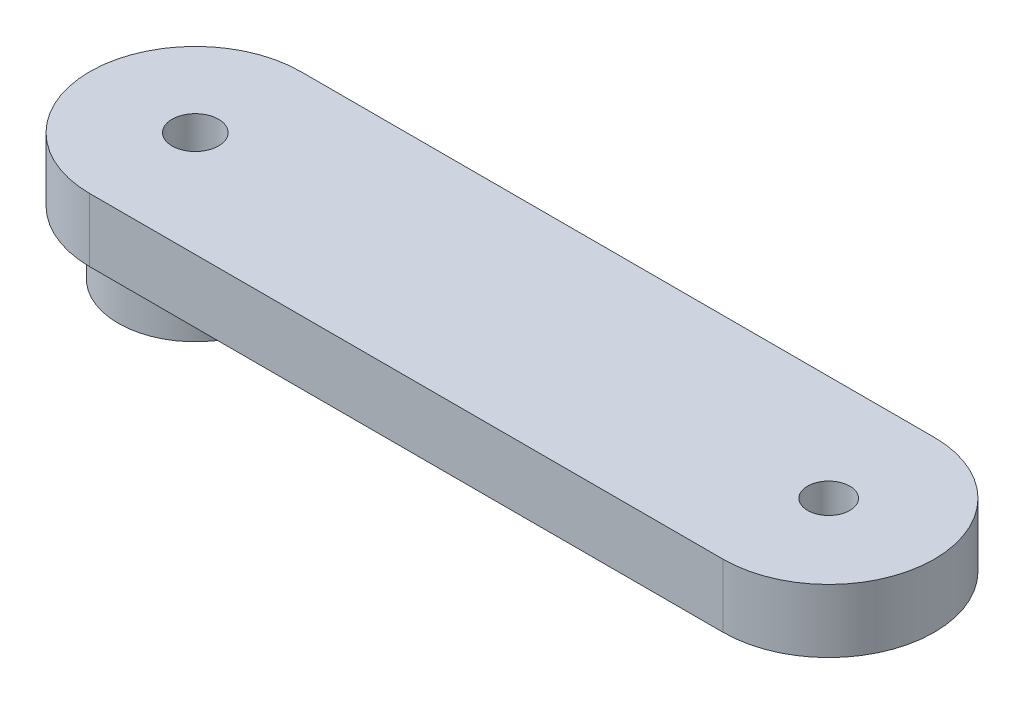
ISO-10303-21;
HEADER;
FILE_DESCRIPTION(('STEP AP214'),'2;1');
FILE_NAME('part.step','',(''),(''),'','','');
FILE_SCHEMA(('AUTOMOTIVE_DESIGN { 1 0 10303 214 1 1 1 1 }'));
ENDSEC;
DATA;
#1=APPLICATION_CONTEXT('core data for automotive mechanical design processes');
#2=APPLICATION_PROTOCOL_DEFINITION('international standard','automotive_design',2000,#1);
#3=PRODUCT_CONTEXT('',#1,'mechanical');
#4=PRODUCT('Part','Part','',(#3));
#5=PRODUCT_RELATED_PRODUCT_CATEGORY('part','',(#4));
#6=PRODUCT_DEFINITION_FORMATION('','',#4);
#7=PRODUCT_DEFINITION_CONTEXT('part definition',#1,'design');
#8=PRODUCT_DEFINITION('design','',#6,#7);
#9=PRODUCT_DEFINITION_SHAPE('','',#8);
#10=(LENGTH_UNIT() NAMED_UNIT(*) SI_UNIT(.MILLI.,.METRE.));
#11=(NAMED_UNIT(*) PLANE_ANGLE_UNIT() SI_UNIT($,.RADIAN.));
#12=(NAMED_UNIT(*) SI_UNIT($,.STERADIAN.) SOLID_ANGLE_UNIT());
#13=UNCERTAINTY_MEASURE_WITH_UNIT(LENGTH_MEASURE(1.E-05),#10,'distance_accuracy_value','');
#14=(GEOMETRIC_REPRESENTATION_CONTEXT(3) GLOBAL_UNCERTAINTY_ASSIGNED_CONTEXT((#13)) GLOBAL_UNIT_ASSIGNED_CONTEXT((#10,
#11,#12)) REPRESENTATION_CONTEXT('',''));
#15=CARTESIAN_POINT('',(0.,0.,0.));
#16=DIRECTION('',(0.,0.,1.));
#17=DIRECTION('',(1.,0.,0.));
#18=AXIS2_PLACEMENT_3D('',#15,#16,#17);
#19=CARTESIAN_POINT('',(0.,6.11126983722081,0.));
#20=DIRECTION('',(0.,-1.,0.));
#21=DIRECTION('',(0.,0.,-1.));
#22=AXIS2_PLACEMENT_3D('',#19,#20,#21);
#23=CYLINDRICAL_SURFACE('',#22,1.1);
#24=CARTESIAN_POINT('',(0.,3.,0.));
#25=DIRECTION('',(0.,1.,0.));
#26=DIRECTION('',(0.,0.,1.));
#27=AXIS2_PLACEMENT_3D('',#24,#25,#26);
#28=CIRCLE('',#27,1.1);
#29=CARTESIAN_POINT('',(0.,3.,1.1));
#30=VERTEX_POINT('',#29);
#31=EDGE_CURVE('E159',#30,#30,#28,.F.);
#32=ORIENTED_EDGE('',*,*,#31,.F.);
#33=EDGE_LOOP('',(#32));
#34=FACE_BOUND('',#33,.T.);
#35=CARTESIAN_POINT('',(0.,1.,0.));
#36=DIRECTION('',(0.,-1.,0.));
#37=DIRECTION('',(0.,0.,-1.));
#38=AXIS2_PLACEMENT_3D('',#35,#36,#37);
#39=CIRCLE('',#38,1.1);
#40=CARTESIAN_POINT('',(0.,1.,-1.1));
#41=VERTEX_POINT('',#40);
#42=EDGE_CURVE('E39',#41,#41,#39,.F.);
#43=ORIENTED_EDGE('',*,*,#42,.F.);
#44=EDGE_LOOP('',(#43));
#45=FACE_BOUND('',#44,.T.);
#46=ADVANCED_FACE('F35',(#34,#45),#23,.F.);
#47=CARTESIAN_POINT('',(0.,3.,-5.));
#48=DIRECTION('',(0.,0.,-1.));
#49=DIRECTION('',(-1.,0.,0.));
#50=AXIS2_PLACEMENT_3D('',#47,#48,#49);
#51=PLANE('',#50);
#52=DIRECTION('',(1.,0.,0.));
#53=VECTOR('',#52,1.);
#54=CARTESIAN_POINT('',(0.,0.,-5.));
#55=LINE('',#54,#53);
#56=CARTESIAN_POINT('',(0.,0.,-5.));
#57=VERTEX_POINT('',#56);
#58=CARTESIAN_POINT('',(30.,0.,-5.));
#59=VERTEX_POINT('',#58);
#60=EDGE_CURVE('E105',#57,#59,#55,.T.);
#61=ORIENTED_EDGE('',*,*,#60,.F.);
#62=DIRECTION('',(0.,-1.,0.));
#63=VECTOR('',#62,1.);
#64=CARTESIAN_POINT('',(0.,3.,-5.));
#65=LINE('',#64,#63);
#66=CARTESIAN_POINT('',(0.,3.,-5.));
#67=VERTEX_POINT('',#66);
#68=EDGE_CURVE('E45',#67,#57,#65,.T.);
#69=ORIENTED_EDGE('',*,*,#68,.F.);
#70=DIRECTION('',(1.,0.,0.));
#71=VECTOR('',#70,1.);
#72=CARTESIAN_POINT('',(0.,3.,-5.));
#73=LINE('',#72,#71);
#74=CARTESIAN_POINT('',(30.,3.,-5.));
#75=VERTEX_POINT('',#74);
#76=EDGE_CURVE('E99',#67,#75,#73,.T.);
#77=ORIENTED_EDGE('',*,*,#76,.T.);
#78=DIRECTION('',(0.,-1.,0.));
#79=VECTOR('',#78,1.);
#80=CARTESIAN_POINT('',(30.,3.,-5.));
#81=LINE('',#80,#79);
#82=EDGE_CURVE('E96',#75,#59,#81,.T.);
#83=ORIENTED_EDGE('',*,*,#82,.T.);
#84=EDGE_LOOP('',(#61,#69,#77,#83));
#85=FACE_BOUND('',#84,.T.);
#86=ADVANCED_FACE('F37',(#85),#51,.T.);
#87=CARTESIAN_POINT('',(0.,3.,0.));
#88=DIRECTION('',(0.,-1.,0.));
#89=DIRECTION('',(0.,0.,-1.));
#90=AXIS2_PLACEMENT_3D('',#87,#88,#89);
#91=CYLINDRICAL_SURFACE('',#90,5.);
#92=CARTESIAN_POINT('',(0.,0.,0.));
#93=DIRECTION('',(0.,1.,0.));
#94=DIRECTION('',(0.,0.,1.));
#95=AXIS2_PLACEMENT_3D('',#92,#93,#94);
#96=CIRCLE('',#95,5.);
#97=CARTESIAN_POINT('',(0.,0.,5.));
#98=VERTEX_POINT('',#97);
#99=EDGE_CURVE('E69',#57,#98,#96,.T.);
#100=ORIENTED_EDGE('',*,*,#99,.T.);
#101=DIRECTION('',(0.,-1.,0.));
#102=VECTOR('',#101,1.);
#103=CARTESIAN_POINT('',(0.,3.,5.));
#104=LINE('',#103,#102);
#105=CARTESIAN_POINT('',(0.,3.,5.));
#106=VERTEX_POINT('',#105);
#107=EDGE_CURVE('E95',#106,#98,#104,.T.);
#108=ORIENTED_EDGE('',*,*,#107,.F.);
#109=CARTESIAN_POINT('',(0.,3.,0.));
#110=DIRECTION('',(0.,1.,0.));
#111=DIRECTION('',(0.,0.,1.));
#112=AXIS2_PLACEMENT_3D('',#109,#110,#111);
#113=CIRCLE('',#112,5.);
#114=EDGE_CURVE('E84',#67,#106,#113,.T.);
#115=ORIENTED_EDGE('',*,*,#114,.F.);
#116=ORIENTED_EDGE('',*,*,#68,.T.);
#117=EDGE_LOOP('',(#100,#108,#115,#116));
#118=FACE_BOUND('',#117,.T.);
#119=ADVANCED_FACE('F139',(#118),#91,.T.);
#120=CARTESIAN_POINT('',(0.,3.,5.));
#121=DIRECTION('',(0.,0.,-1.));
#122=DIRECTION('',(-1.,0.,0.));
#123=AXIS2_PLACEMENT_3D('',#120,#121,#122);
#124=PLANE('',#123);
#125=DIRECTION('',(1.,0.,0.));
#126=VECTOR('',#125,1.);
#127=CARTESIAN_POINT('',(0.,0.,5.));
#128=LINE('',#127,#126);
#129=CARTESIAN_POINT('',(30.,0.,5.));
#130=VERTEX_POINT('',#129);
#131=EDGE_CURVE('E91',#98,#130,#128,.T.);
#132=ORIENTED_EDGE('',*,*,#131,.T.);
#133=DIRECTION('',(0.,-1.,0.));
#134=VECTOR('',#133,1.);
#135=CARTESIAN_POINT('',(30.,3.,5.));
#136=LINE('',#135,#134);
#137=CARTESIAN_POINT('',(30.,3.,5.));
#138=VERTEX_POINT('',#137);
#139=EDGE_CURVE('E88',#138,#130,#136,.T.);
#140=ORIENTED_EDGE('',*,*,#139,.F.);
#141=DIRECTION('',(1.,0.,0.));
#142=VECTOR('',#141,1.);
#143=CARTESIAN_POINT('',(0.,3.,5.));
#144=LINE('',#143,#142);
#145=EDGE_CURVE('E81',#106,#138,#144,.T.);
#146=ORIENTED_EDGE('',*,*,#145,.F.);
#147=ORIENTED_EDGE('',*,*,#107,.T.);
#148=EDGE_LOOP('',(#132,#140,#146,#147));
#149=FACE_BOUND('',#148,.T.);
#150=ADVANCED_FACE('F89',(#149),#124,.F.);
#151=CARTESIAN_POINT('',(30.,3.,0.));
#152=DIRECTION('',(0.,-1.,0.));
#153=DIRECTION('',(0.,0.,-1.));
#154=AXIS2_PLACEMENT_3D('',#151,#152,#153);
#155=CYLINDRICAL_SURFACE('',#154,5.);
#156=CARTESIAN_POINT('',(30.,0.,0.));
#157=DIRECTION('',(0.,1.,0.));
#158=DIRECTION('',(0.,0.,1.));
#159=AXIS2_PLACEMENT_3D('',#156,#157,#158);
#160=CIRCLE('',#159,5.);
#161=EDGE_CURVE('E108',#130,#59,#160,.T.);
#162=ORIENTED_EDGE('',*,*,#161,.T.);
#163=ORIENTED_EDGE('',*,*,#82,.F.);
#164=CARTESIAN_POINT('',(30.,3.,0.));
#165=DIRECTION('',(0.,1.,0.));
#166=DIRECTION('',(0.,0.,1.));
#167=AXIS2_PLACEMENT_3D('',#164,#165,#166);
#168=CIRCLE('',#167,5.);
#169=EDGE_CURVE('E78',#138,#75,#168,.T.);
#170=ORIENTED_EDGE('',*,*,#169,.F.);
#171=ORIENTED_EDGE('',*,*,#139,.T.);
#172=EDGE_LOOP('',(#162,#163,#170,#171));
#173=FACE_BOUND('',#172,.T.);
#174=ADVANCED_FACE('F98',(#173),#155,.T.);
#175=CARTESIAN_POINT('',(30.,3.,0.));
#176=DIRECTION('',(0.,1.,0.));
#177=DIRECTION('',(0.,0.,1.));
#178=AXIS2_PLACEMENT_3D('',#175,#176,#177);
#179=PLANE('',#178);
#180=CARTESIAN_POINT('',(30.,3.,0.));
#181=DIRECTION('',(0.,1.,0.));
#182=DIRECTION('',(0.,0.,1.));
#183=AXIS2_PLACEMENT_3D('',#180,#181,#182);
#184=CIRCLE('',#183,1.);
#185=CARTESIAN_POINT('',(30.,3.,1.));
#186=VERTEX_POINT('',#185);
#187=EDGE_CURVE('E170',#186,#186,#184,.T.);
#188=ORIENTED_EDGE('',*,*,#187,.F.);
#189=EDGE_LOOP('',(#188));
#190=FACE_BOUND('',#189,.T.);
#191=ORIENTED_EDGE('',*,*,#31,.T.);
#192=EDGE_LOOP('',(#191));
#193=FACE_BOUND('',#192,.T.);
#194=ORIENTED_EDGE('',*,*,#76,.F.);
#195=ORIENTED_EDGE('',*,*,#114,.T.);
#196=ORIENTED_EDGE('',*,*,#145,.T.);
#197=ORIENTED_EDGE('',*,*,#169,.T.);
#198=EDGE_LOOP('',(#194,#195,#196,#197));
#199=FACE_BOUND('',#198,.T.);
#200=ADVANCED_FACE('F83',(#190,#193,#199),#179,.T.);
#201=CARTESIAN_POINT('',(30.,0.,0.));
#202=DIRECTION('',(0.,1.,0.));
#203=DIRECTION('',(0.,0.,1.));
#204=AXIS2_PLACEMENT_3D('',#201,#202,#203);
#205=PLANE('',#204);
#206=CARTESIAN_POINT('',(30.,0.,0.));
#207=DIRECTION('',(0.,1.,0.));
#208=DIRECTION('',(0.,0.,1.));
#209=AXIS2_PLACEMENT_3D('',#206,#207,#208);
#210=CIRCLE('',#209,1.);
#211=CARTESIAN_POINT('',(30.,0.,1.));
#212=VERTEX_POINT('',#211);
#213=EDGE_CURVE('E165',#212,#212,#210,.F.);
#214=ORIENTED_EDGE('',*,*,#213,.F.);
#215=EDGE_LOOP('',(#214));
#216=FACE_BOUND('',#215,.T.);
#217=CARTESIAN_POINT('',(0.,0.,0.));
#218=DIRECTION('',(0.,1.,0.));
#219=DIRECTION('',(0.,0.,1.));
#220=AXIS2_PLACEMENT_3D('',#217,#218,#219);
#221=CIRCLE('',#220,3.65);
#222=CARTESIAN_POINT('',(0.,0.,3.65));
#223=VERTEX_POINT('',#222);
#224=EDGE_CURVE('E11',#223,#223,#221,.F.);
#225=ORIENTED_EDGE('',*,*,#224,.F.);
#226=EDGE_LOOP('',(#225));
#227=FACE_BOUND('',#226,.T.);
#228=ORIENTED_EDGE('',*,*,#60,.T.);
#229=ORIENTED_EDGE('',*,*,#161,.F.);
#230=ORIENTED_EDGE('',*,*,#131,.F.);
#231=ORIENTED_EDGE('',*,*,#99,.F.);
#232=EDGE_LOOP('',(#228,#229,#230,#231));
#233=FACE_BOUND('',#232,.T.);
#234=ADVANCED_FACE('F116',(#216,#227,#233),#205,.F.);
#235=CARTESIAN_POINT('',(0.,-3.,0.));
#236=DIRECTION('',(0.,1.,0.));
#237=DIRECTION('',(0.,0.,1.));
#238=AXIS2_PLACEMENT_3D('',#235,#236,#237);
#239=CYLINDRICAL_SURFACE('',#238,3.65);
#240=CARTESIAN_POINT('',(0.,-3.,0.));
#241=DIRECTION('',(0.,-1.,0.));
#242=DIRECTION('',(0.,0.,-1.));
#243=AXIS2_PLACEMENT_3D('',#240,#241,#242);
#244=CIRCLE('',#243,3.65);
#245=CARTESIAN_POINT('',(0.,-3.,-3.65));
#246=VERTEX_POINT('',#245);
#247=EDGE_CURVE('E109',#246,#246,#244,.T.);
#248=ORIENTED_EDGE('',*,*,#247,.F.);
#249=EDGE_LOOP('',(#248));
#250=FACE_BOUND('',#249,.T.);
#251=ORIENTED_EDGE('',*,*,#224,.T.);
#252=EDGE_LOOP('',(#251));
#253=FACE_BOUND('',#252,.T.);
#254=ADVANCED_FACE('F118',(#250,#253),#239,.T.);
#255=CARTESIAN_POINT('',(0.,-3.,0.));
#256=DIRECTION('',(0.,-1.,0.));
#257=DIRECTION('',(0.,0.,-1.));
#258=AXIS2_PLACEMENT_3D('',#255,#256,#257);
#259=PLANE('',#258);
#260=CARTESIAN_POINT('',(0.,-3.,0.));
#261=DIRECTION('',(0.,-1.,0.));
#262=DIRECTION('',(0.,0.,-1.));
#263=AXIS2_PLACEMENT_3D('',#260,#261,#262);
#264=CIRCLE('',#263,2.65);
#265=CARTESIAN_POINT('',(0.,-3.,-2.65));
#266=VERTEX_POINT('',#265);
#267=EDGE_CURVE('E156',#266,#266,#264,.T.);
#268=ORIENTED_EDGE('',*,*,#267,.F.);
#269=EDGE_LOOP('',(#268));
#270=FACE_BOUND('',#269,.T.);
#271=ORIENTED_EDGE('',*,*,#247,.T.);
#272=EDGE_LOOP('',(#271));
#273=FACE_BOUND('',#272,.T.);
#274=ADVANCED_FACE('F125',(#270,#273),#259,.T.);
#275=CARTESIAN_POINT('',(0.,1.,0.));
#276=DIRECTION('',(0.,-1.,0.));
#277=DIRECTION('',(0.,0.,-1.));
#278=AXIS2_PLACEMENT_3D('',#275,#276,#277);
#279=PLANE('',#278);
#280=CARTESIAN_POINT('',(0.,1.,0.));
#281=DIRECTION('',(0.,-1.,0.));
#282=DIRECTION('',(0.,0.,-1.));
#283=AXIS2_PLACEMENT_3D('',#280,#281,#282);
#284=CIRCLE('',#283,2.65);
#285=CARTESIAN_POINT('',(0.,1.,-2.65));
#286=VERTEX_POINT('',#285);
#287=EDGE_CURVE('E164',#286,#286,#284,.T.);
#288=ORIENTED_EDGE('',*,*,#287,.T.);
#289=EDGE_LOOP('',(#288));
#290=FACE_BOUND('',#289,.T.);
#291=ORIENTED_EDGE('',*,*,#42,.T.);
#292=EDGE_LOOP('',(#291));
#293=FACE_BOUND('',#292,.T.);
#294=ADVANCED_FACE('F147',(#290,#293),#279,.T.);
#295=CARTESIAN_POINT('',(0.,1.,0.));
#296=DIRECTION('',(0.,-1.,0.));
#297=DIRECTION('',(0.,0.,-1.));
#298=AXIS2_PLACEMENT_3D('',#295,#296,#297);
#299=CYLINDRICAL_SURFACE('',#298,2.65);
#300=ORIENTED_EDGE('',*,*,#287,.F.);
#301=EDGE_LOOP('',(#300));
#302=FACE_BOUND('',#301,.T.);
#303=ORIENTED_EDGE('',*,*,#267,.T.);
#304=EDGE_LOOP('',(#303));
#305=FACE_BOUND('',#304,.T.);
#306=ADVANCED_FACE('F144',(#302,#305),#299,.F.);
#307=CARTESIAN_POINT('',(30.,-2.82842712474619,0.));
#308=DIRECTION('',(0.,1.,0.));
#309=DIRECTION('',(0.,0.,1.));
#310=AXIS2_PLACEMENT_3D('',#307,#308,#309);
#311=CYLINDRICAL_SURFACE('',#310,1.);
#312=ORIENTED_EDGE('',*,*,#213,.T.);
#313=EDGE_LOOP('',(#312));
#314=FACE_BOUND('',#313,.T.);
#315=ORIENTED_EDGE('',*,*,#187,.T.);
#316=EDGE_LOOP('',(#315));
#317=FACE_BOUND('',#316,.T.);
#318=ADVANCED_FACE('F174',(#314,#317),#311,.F.);
#319=CLOSED_SHELL('',(#46,#86,#119,#150,#174,#200,#234,#254,#274,#294,#306,#318));
#320=MANIFOLD_SOLID_BREP('B2',#319);
#321=ADVANCED_BREP_SHAPE_REPRESENTATION('',(#18,#320),#14);
#322=SHAPE_DEFINITION_REPRESENTATION(#9,#321);
ENDSEC;
END-ISO-10303-21;
